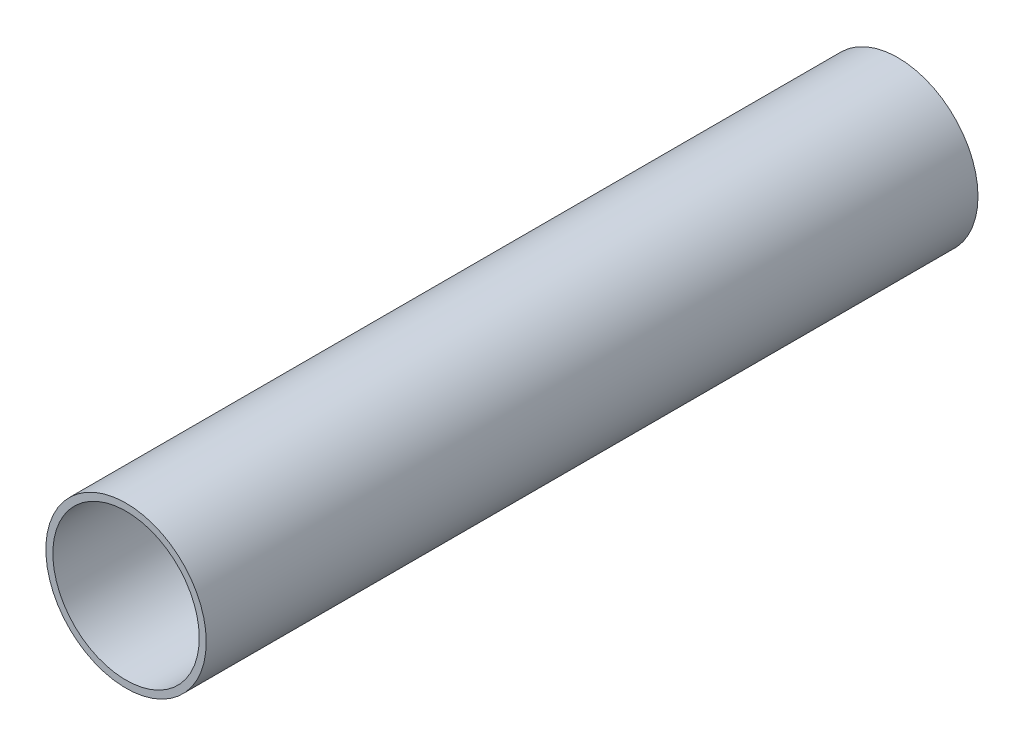
ISO-10303-21;
HEADER;
FILE_DESCRIPTION(('STEP AP214'),'2;1');
FILE_NAME('part.step','',(''),(''),'','','');
FILE_SCHEMA(('AUTOMOTIVE_DESIGN { 1 0 10303 214 1 1 1 1 }'));
ENDSEC;
DATA;
#1=APPLICATION_CONTEXT('core data for automotive mechanical design processes');
#2=APPLICATION_PROTOCOL_DEFINITION('international standard','automotive_design',2000,#1);
#3=PRODUCT_CONTEXT('',#1,'mechanical');
#4=PRODUCT('Part','Part','',(#3));
#5=PRODUCT_RELATED_PRODUCT_CATEGORY('part','',(#4));
#6=PRODUCT_DEFINITION_FORMATION('','',#4);
#7=PRODUCT_DEFINITION_CONTEXT('part definition',#1,'design');
#8=PRODUCT_DEFINITION('design','',#6,#7);
#9=PRODUCT_DEFINITION_SHAPE('','',#8);
#10=(LENGTH_UNIT() NAMED_UNIT(*) SI_UNIT(.MILLI.,.METRE.));
#11=(NAMED_UNIT(*) PLANE_ANGLE_UNIT() SI_UNIT($,.RADIAN.));
#12=(NAMED_UNIT(*) SI_UNIT($,.STERADIAN.) SOLID_ANGLE_UNIT());
#13=UNCERTAINTY_MEASURE_WITH_UNIT(LENGTH_MEASURE(1.E-05),#10,'distance_accuracy_value','');
#14=(GEOMETRIC_REPRESENTATION_CONTEXT(3) GLOBAL_UNCERTAINTY_ASSIGNED_CONTEXT((#13)) GLOBAL_UNIT_ASSIGNED_CONTEXT((#10,
#11,#12)) REPRESENTATION_CONTEXT('',''));
#15=CARTESIAN_POINT('',(0.,0.,0.));
#16=DIRECTION('',(0.,0.,1.));
#17=DIRECTION('',(1.,0.,0.));
#18=AXIS2_PLACEMENT_3D('',#15,#16,#17);
#19=CARTESIAN_POINT('',(0.,0.,434.84961733176));
#20=DIRECTION('',(0.,0.,-1.));
#21=DIRECTION('',(-1.,0.,0.));
#22=AXIS2_PLACEMENT_3D('',#19,#20,#21);
#23=CYLINDRICAL_SURFACE('',#22,34.925);
#24=CARTESIAN_POINT('',(0.,0.,0.));
#25=DIRECTION('',(0.,0.,1.));
#26=DIRECTION('',(1.,0.,0.));
#27=AXIS2_PLACEMENT_3D('',#24,#25,#26);
#28=CIRCLE('',#27,34.925);
#29=CARTESIAN_POINT('',(34.925,0.,0.));
#30=VERTEX_POINT('',#29);
#31=EDGE_CURVE('E40',#30,#30,#28,.T.);
#32=ORIENTED_EDGE('',*,*,#31,.T.);
#33=EDGE_LOOP('',(#32));
#34=FACE_BOUND('',#33,.T.);
#35=CARTESIAN_POINT('',(0.,0.,336.0668));
#36=DIRECTION('',(0.,0.,1.));
#37=DIRECTION('',(1.,0.,0.));
#38=AXIS2_PLACEMENT_3D('',#35,#36,#37);
#39=CIRCLE('',#38,34.925);
#40=CARTESIAN_POINT('',(34.925,0.,336.0668));
#41=VERTEX_POINT('',#40);
#42=EDGE_CURVE('E10',#41,#41,#39,.T.);
#43=ORIENTED_EDGE('',*,*,#42,.F.);
#44=EDGE_LOOP('',(#43));
#45=FACE_BOUND('',#44,.T.);
#46=ADVANCED_FACE('F33',(#34,#45),#23,.T.);
#47=CARTESIAN_POINT('',(0.,0.,0.));
#48=DIRECTION('',(0.,0.,1.));
#49=DIRECTION('',(1.,0.,0.));
#50=AXIS2_PLACEMENT_3D('',#47,#48,#49);
#51=PLANE('',#50);
#52=ORIENTED_EDGE('',*,*,#31,.F.);
#53=EDGE_LOOP('',(#52));
#54=FACE_BOUND('',#53,.T.);
#55=CARTESIAN_POINT('',(0.,0.,0.));
#56=DIRECTION('',(0.,0.,1.));
#57=DIRECTION('',(1.,0.,0.));
#58=AXIS2_PLACEMENT_3D('',#55,#56,#57);
#59=CIRCLE('',#58,31.877);
#60=CARTESIAN_POINT('',(31.877,0.,0.));
#61=VERTEX_POINT('',#60);
#62=EDGE_CURVE('E45',#61,#61,#59,.T.);
#63=ORIENTED_EDGE('',*,*,#62,.T.);
#64=EDGE_LOOP('',(#63));
#65=FACE_BOUND('',#64,.T.);
#66=ADVANCED_FACE('F61',(#54,#65),#51,.F.);
#67=CARTESIAN_POINT('',(0.,0.,434.84961733176));
#68=DIRECTION('',(0.,0.,-1.));
#69=DIRECTION('',(-1.,0.,0.));
#70=AXIS2_PLACEMENT_3D('',#67,#68,#69);
#71=CYLINDRICAL_SURFACE('',#70,31.877);
#72=ORIENTED_EDGE('',*,*,#62,.F.);
#73=EDGE_LOOP('',(#72));
#74=FACE_BOUND('',#73,.T.);
#75=CARTESIAN_POINT('',(0.,0.,336.0668));
#76=DIRECTION('',(0.,0.,1.));
#77=DIRECTION('',(1.,0.,0.));
#78=AXIS2_PLACEMENT_3D('',#75,#76,#77);
#79=CIRCLE('',#78,31.877);
#80=CARTESIAN_POINT('',(31.877,0.,336.0668));
#81=VERTEX_POINT('',#80);
#82=EDGE_CURVE('E36',#81,#81,#79,.T.);
#83=ORIENTED_EDGE('',*,*,#82,.T.);
#84=EDGE_LOOP('',(#83));
#85=FACE_BOUND('',#84,.T.);
#86=ADVANCED_FACE('F53',(#74,#85),#71,.F.);
#87=CARTESIAN_POINT('',(-9.50663168751738,34.4304088782052,336.0668));
#88=DIRECTION('',(0.,0.,1.));
#89=DIRECTION('',(0.963930957220093,0.266152418198212,0.));
#90=AXIS2_PLACEMENT_3D('',#87,#88,#89);
#91=PLANE('',#90);
#92=ORIENTED_EDGE('',*,*,#82,.F.);
#93=EDGE_LOOP('',(#92));
#94=FACE_BOUND('',#93,.T.);
#95=ORIENTED_EDGE('',*,*,#42,.T.);
#96=EDGE_LOOP('',(#95));
#97=FACE_BOUND('',#96,.T.);
#98=ADVANCED_FACE('F55',(#94,#97),#91,.T.);
#99=CLOSED_SHELL('',(#46,#66,#86,#98));
#100=MANIFOLD_SOLID_BREP('B2',#99);
#101=ADVANCED_BREP_SHAPE_REPRESENTATION('',(#18,#100),#14);
#102=SHAPE_DEFINITION_REPRESENTATION(#9,#101);
ENDSEC;
END-ISO-10303-21;
